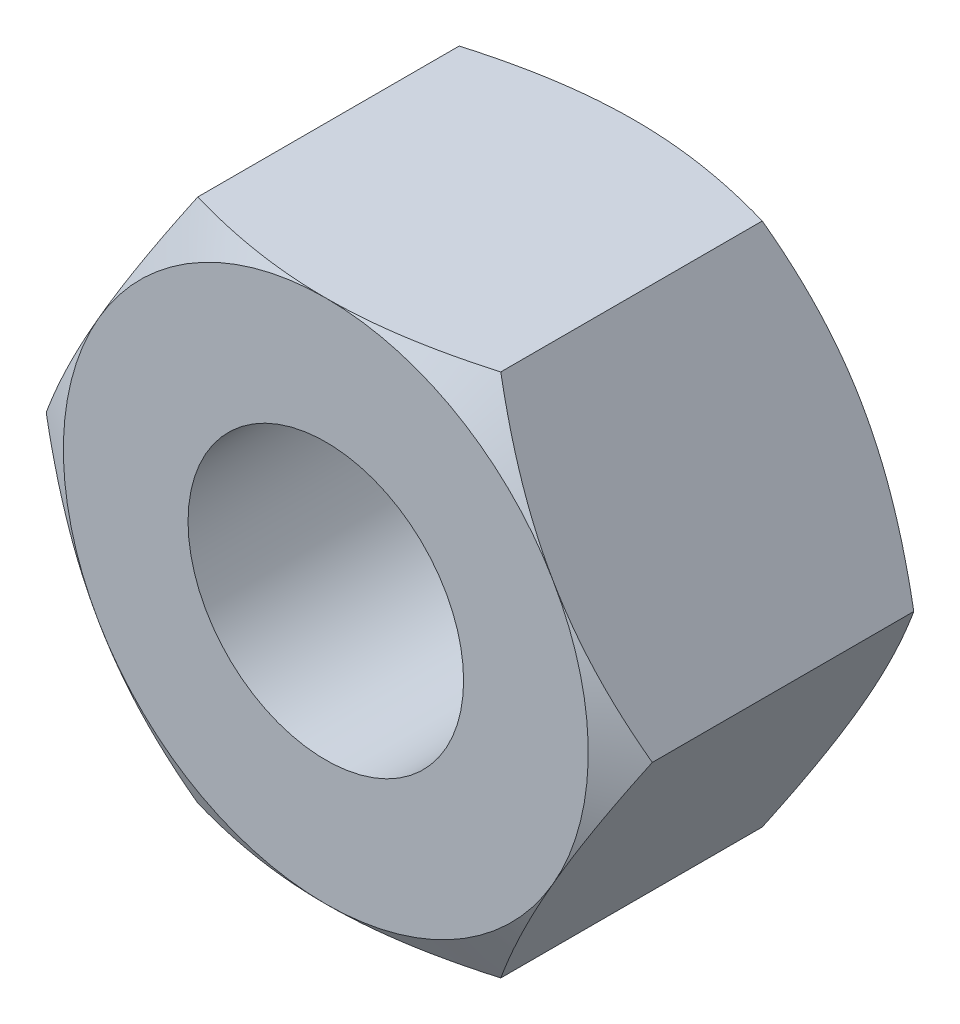
ISO-10303-21;
HEADER;
FILE_DESCRIPTION(('STEP AP214'),'2;1');
FILE_NAME('part.step','',(''),(''),'','','');
FILE_SCHEMA(('AUTOMOTIVE_DESIGN { 1 0 10303 214 1 1 1 1 }'));
ENDSEC;
DATA;
#1=APPLICATION_CONTEXT('core data for automotive mechanical design processes');
#2=APPLICATION_PROTOCOL_DEFINITION('international standard','automotive_design',2000,#1);
#3=PRODUCT_CONTEXT('',#1,'mechanical');
#4=PRODUCT('Part','Part','',(#3));
#5=PRODUCT_RELATED_PRODUCT_CATEGORY('part','',(#4));
#6=PRODUCT_DEFINITION_FORMATION('','',#4);
#7=PRODUCT_DEFINITION_CONTEXT('part definition',#1,'design');
#8=PRODUCT_DEFINITION('design','',#6,#7);
#9=PRODUCT_DEFINITION_SHAPE('','',#8);
#10=(LENGTH_UNIT() NAMED_UNIT(*) SI_UNIT(.MILLI.,.METRE.));
#11=(NAMED_UNIT(*) PLANE_ANGLE_UNIT() SI_UNIT($,.RADIAN.));
#12=(NAMED_UNIT(*) SI_UNIT($,.STERADIAN.) SOLID_ANGLE_UNIT());
#13=UNCERTAINTY_MEASURE_WITH_UNIT(LENGTH_MEASURE(1.E-05),#10,'distance_accuracy_value','');
#14=(GEOMETRIC_REPRESENTATION_CONTEXT(3) GLOBAL_UNCERTAINTY_ASSIGNED_CONTEXT((#13)) GLOBAL_UNIT_ASSIGNED_CONTEXT((#10,
#11,#12)) REPRESENTATION_CONTEXT('',''));
#15=CARTESIAN_POINT('',(0.,0.,0.));
#16=DIRECTION('',(0.,0.,1.));
#17=DIRECTION('',(1.,0.,0.));
#18=AXIS2_PLACEMENT_3D('',#15,#16,#17);
#19=CARTESIAN_POINT('',(0.,0.,4.7));
#20=DIRECTION('',(0.,0.,-1.));
#21=DIRECTION('',(-1.,0.,0.));
#22=AXIS2_PLACEMENT_3D('',#19,#20,#21);
#23=CYLINDRICAL_SURFACE('',#22,2.5);
#24=CARTESIAN_POINT('',(0.,0.,4.7));
#25=DIRECTION('',(0.,0.,-1.));
#26=DIRECTION('',(1.,0.,0.));
#27=AXIS2_PLACEMENT_3D('',#24,#25,#26);
#28=CIRCLE('',#27,2.5);
#29=CARTESIAN_POINT('',(2.5,0.,4.7));
#30=VERTEX_POINT('',#29);
#31=EDGE_CURVE('P0_E11',#30,#30,#28,.T.);
#32=ORIENTED_EDGE('',*,*,#31,.T.);
#33=CARTESIAN_POINT('',(2.5,0.,0.));
#34=DIRECTION('',(0.,0.,1.));
#35=VECTOR('',#34,1.);
#36=LINE('',#33,#35);
#37=CARTESIAN_POINT('',(2.5,0.,0.));
#38=VERTEX_POINT('',#37);
#39=EDGE_CURVE('P0_E24',#38,#30,#36,.T.);
#40=ORIENTED_EDGE('',*,*,#39,.F.);
#41=CARTESIAN_POINT('',(0.,0.,0.));
#42=DIRECTION('',(0.,0.,1.));
#43=DIRECTION('',(1.,0.,0.));
#44=AXIS2_PLACEMENT_3D('',#41,#42,#43);
#45=CIRCLE('',#44,2.5);
#46=EDGE_CURVE('P0_E33',#38,#38,#45,.T.);
#47=ORIENTED_EDGE('',*,*,#46,.T.);
#48=ORIENTED_EDGE('',*,*,#39,.T.);
#49=EDGE_LOOP('',(#32,#40,#47,#48));
#50=FACE_BOUND('',#49,.T.);
#51=ADVANCED_FACE('P0_F16',(#50),#23,.T.);
#52=OPEN_SHELL('',(#51));
#53=SHELL_BASED_SURFACE_MODEL('P0_B1',(#52));
#54=CARTESIAN_POINT('',(0.,0.,4.34059081658233));
#55=DIRECTION('',(0.,0.,-1.));
#56=DIRECTION('',(-1.,0.,0.));
#57=AXIS2_PLACEMENT_3D('',#54,#55,#56);
#58=CONICAL_SURFACE('',#57,4.62251496634281,1.04719755120482);
#59=CARTESIAN_POINT('',(3.66182548670557E-11,4.,4.69999999996809));
#60=CARTESIAN_POINT('',(1.07179676977495,4.,4.69999999996243));
#61=CARTESIAN_POINT('',(2.30940107683523,4.,4.34273441004457));
#62=(BOUNDED_CURVE() B_SPLINE_CURVE(2,(#59,#60,#61),.UNSPECIFIED.,.F.,
.F.) B_SPLINE_CURVE_WITH_KNOTS((3,3),(1.44548094706346,1.96660610414273),
.UNSPECIFIED.) CURVE() GEOMETRIC_REPRESENTATION_ITEM() RATIONAL_B_SPLINE_CURVE((2.2340862004142,
2.23408620041146,2.07368602792917)) REPRESENTATION_ITEM(''));
#63=CARTESIAN_POINT('',(2.24250503652258E-11,4.00000000000955,4.69999999995707));
#64=VERTEX_POINT('',#63);
#65=CARTESIAN_POINT('',(2.30940107675698,3.99999999999697,4.34273441006868));
#66=VERTEX_POINT('',#65);
#67=EDGE_CURVE('P1_E215',#64,#66,#62,.T.);
#68=ORIENTED_EDGE('',*,*,#67,.F.);
#69=CARTESIAN_POINT('',(0.,0.,4.69999999995707));
#70=DIRECTION('',(0.,0.,1.));
#71=DIRECTION('',(-1.,0.,0.));
#72=AXIS2_PLACEMENT_3D('',#69,#70,#71);
#73=CIRCLE('',#72,4.0000000000191);
#74=CARTESIAN_POINT('',(3.46410161512406,2.00000000004277,4.69999999995707));
#75=VERTEX_POINT('',#74);
#76=EDGE_CURVE('P1_E191',#75,#64,#73,.T.);
#77=ORIENTED_EDGE('',*,*,#76,.F.);
#78=CARTESIAN_POINT('',(2.3094010767675,3.99999999998423,4.34273441007201));
#79=CARTESIAN_POINT('',(2.92820323025991,2.92820323030239,4.69999999995706));
#80=CARTESIAN_POINT('',(3.46410161510191,2.00000000006199,4.69999999996812));
#81=(BOUNDED_CURVE() B_SPLINE_CURVE(2,(#78,#79,#80),.UNSPECIFIED.,.F.,
.F.) B_SPLINE_CURVE_WITH_KNOTS((3,3),(0.924355789986596,1.4454809470394),
.UNSPECIFIED.) CURVE() GEOMETRIC_REPRESENTATION_ITEM() RATIONAL_B_SPLINE_CURVE((2.07368602794278,
2.23408620041121,2.23408620041656)) REPRESENTATION_ITEM(''));
#82=EDGE_CURVE('P1_E28',#66,#75,#81,.T.);
#83=ORIENTED_EDGE('',*,*,#82,.F.);
#84=EDGE_LOOP('',(#68,#77,#83));
#85=FACE_BOUND('',#84,.T.);
#86=ADVANCED_FACE('P1_F17',(#85),#58,.T.);
#87=CARTESIAN_POINT('',(0.,0.,4.34059081658233));
#88=DIRECTION('',(0.,0.,-1.));
#89=DIRECTION('',(-1.,0.,0.));
#90=AXIS2_PLACEMENT_3D('',#87,#88,#89);
#91=CONICAL_SURFACE('',#90,4.62251496634281,1.04719755120482);
#92=CARTESIAN_POINT('',(-3.46410161506336,2.00000000012981,4.69999999996782));
#93=CARTESIAN_POINT('',(-2.92820323021455,2.92820323038201,4.69999999994469));
#94=CARTESIAN_POINT('',(-2.30940107670599,4.00000000009182,4.34273441003597));
#95=(BOUNDED_CURVE() B_SPLINE_CURVE(2,(#92,#93,#94),.UNSPECIFIED.,.F.,
.F.) B_SPLINE_CURVE_WITH_KNOTS((3,3),(1.44548094709226,1.96660610415005),
.UNSPECIFIED.) CURVE() GEOMETRIC_REPRESENTATION_ITEM() RATIONAL_B_SPLINE_CURVE((2.23408620041543,
2.23408620040424,2.07368602792686)) REPRESENTATION_ITEM(''));
#96=CARTESIAN_POINT('',(-3.46410161510615,2.00000000007432,4.69999999995707));
#97=VERTEX_POINT('',#96);
#98=CARTESIAN_POINT('',(-2.30940107675731,3.99999999999707,4.34273441006853));
#99=VERTEX_POINT('',#98);
#100=EDGE_CURVE('P1_E268',#97,#99,#95,.T.);
#101=ORIENTED_EDGE('',*,*,#100,.F.);
#102=CARTESIAN_POINT('',(0.,0.,4.69999999995707));
#103=DIRECTION('',(0.,0.,1.));
#104=DIRECTION('',(-1.,0.,0.));
#105=AXIS2_PLACEMENT_3D('',#102,#103,#104);
#106=CIRCLE('',#105,4.0000000000191);
#107=EDGE_CURVE('P1_E179',#64,#97,#106,.T.);
#108=ORIENTED_EDGE('',*,*,#107,.F.);
#109=CARTESIAN_POINT('',(-2.30940107674098,4.,4.34273441007178));
#110=CARTESIAN_POINT('',(-1.07179676969782,4.,4.69999999997376));
#111=CARTESIAN_POINT('',(3.66182548670557E-11,4.,4.69999999996809));
#112=(BOUNDED_CURVE() B_SPLINE_CURVE(2,(#109,#110,#111),.UNSPECIFIED.,.F.,
.F.) B_SPLINE_CURVE_WITH_KNOTS((3,3),(0.924355789984812,1.44548094706346),
.UNSPECIFIED.) CURVE() GEOMETRIC_REPRESENTATION_ITEM() RATIONAL_B_SPLINE_CURVE((2.0736860279405,
2.23408620041694,2.2340862004142)) REPRESENTATION_ITEM(''));
#113=EDGE_CURVE('P1_E197',#99,#64,#112,.T.);
#114=ORIENTED_EDGE('',*,*,#113,.F.);
#115=EDGE_LOOP('',(#101,#108,#114));
#116=FACE_BOUND('',#115,.T.);
#117=ADVANCED_FACE('P1_F485',(#116),#91,.T.);
#118=CARTESIAN_POINT('',(0.,0.,4.34059081658233));
#119=DIRECTION('',(0.,0.,-1.));
#120=DIRECTION('',(-1.,0.,0.));
#121=AXIS2_PLACEMENT_3D('',#118,#119,#120);
#122=CONICAL_SURFACE('',#121,4.62251496634281,1.04719755120482);
#123=CARTESIAN_POINT('',(-3.66182548670557E-11,-4.,4.69999999996809));
#124=CARTESIAN_POINT('',(-1.07179676977495,-4.,4.69999999996243));
#125=CARTESIAN_POINT('',(-2.30940107683523,-4.,4.34273441004457));
#126=(BOUNDED_CURVE() B_SPLINE_CURVE(2,(#123,#124,#125),.UNSPECIFIED.,.F.,
.F.) B_SPLINE_CURVE_WITH_KNOTS((3,3),(1.44548094706346,1.96660610414273),
.UNSPECIFIED.) CURVE() GEOMETRIC_REPRESENTATION_ITEM() RATIONAL_B_SPLINE_CURVE((2.2340862004142,
2.23408620041146,2.07368602792917)) REPRESENTATION_ITEM(''));
#127=CARTESIAN_POINT('',(-2.24243613466561E-11,-4.00000000000955,4.69999999995707));
#128=VERTEX_POINT('',#127);
#129=CARTESIAN_POINT('',(-2.30940107675698,-3.99999999999697,4.34273441006868));
#130=VERTEX_POINT('',#129);
#131=EDGE_CURVE('P1_E151',#128,#130,#126,.T.);
#132=ORIENTED_EDGE('',*,*,#131,.F.);
#133=CARTESIAN_POINT('',(0.,0.,4.69999999995707));
#134=DIRECTION('',(0.,0.,1.));
#135=DIRECTION('',(-1.,0.,0.));
#136=AXIS2_PLACEMENT_3D('',#133,#134,#135);
#137=CIRCLE('',#136,4.0000000000191);
#138=CARTESIAN_POINT('',(-3.46410161512406,-2.00000000004277,4.69999999995707));
#139=VERTEX_POINT('',#138);
#140=EDGE_CURVE('P1_E155',#139,#128,#137,.T.);
#141=ORIENTED_EDGE('',*,*,#140,.F.);
#142=CARTESIAN_POINT('',(-2.3094010767675,-3.99999999998423,4.34273441007201));
#143=CARTESIAN_POINT('',(-2.92820323025991,-2.92820323030239,4.69999999995706));
#144=CARTESIAN_POINT('',(-3.46410161510191,-2.00000000006199,4.69999999996812));
#145=(BOUNDED_CURVE() B_SPLINE_CURVE(2,(#142,#143,#144),.UNSPECIFIED.,.F.,
.F.) B_SPLINE_CURVE_WITH_KNOTS((3,3),(0.924355789986596,1.4454809470394),
.UNSPECIFIED.) CURVE() GEOMETRIC_REPRESENTATION_ITEM() RATIONAL_B_SPLINE_CURVE((2.07368602794278,
2.23408620041121,2.23408620041656)) REPRESENTATION_ITEM(''));
#146=EDGE_CURVE('P1_E157',#130,#139,#145,.T.);
#147=ORIENTED_EDGE('',*,*,#146,.F.);
#148=EDGE_LOOP('',(#132,#141,#147));
#149=FACE_BOUND('',#148,.T.);
#150=ADVANCED_FACE('P1_F153',(#149),#122,.T.);
#151=CARTESIAN_POINT('',(0.,0.,4.34059081658233));
#152=DIRECTION('',(0.,0.,-1.));
#153=DIRECTION('',(-1.,0.,0.));
#154=AXIS2_PLACEMENT_3D('',#151,#152,#153);
#155=CONICAL_SURFACE('',#154,4.62251496634281,1.04719755120482);
#156=CARTESIAN_POINT('',(3.46410161507275,-2.00000000011355,4.69999999996783));
#157=CARTESIAN_POINT('',(2.92820323022575,-2.92820323036259,4.6999999999476));
#158=CARTESIAN_POINT('',(2.30940107672136,-4.0000000000652,4.34273441004484));
#159=(BOUNDED_CURVE() B_SPLINE_CURVE(2,(#156,#157,#158),.UNSPECIFIED.,.F.,
.F.) B_SPLINE_CURVE_WITH_KNOTS((3,3),(1.4454809470881,1.96660610414455),
.UNSPECIFIED.) CURVE() GEOMETRIC_REPRESENTATION_ITEM() RATIONAL_B_SPLINE_CURVE((2.23408620041586,
2.23408620040607,2.07368602793095)) REPRESENTATION_ITEM(''));
#160=CARTESIAN_POINT('',(3.46410161510615,-2.00000000007432,4.69999999995707));
#161=VERTEX_POINT('',#160);
#162=CARTESIAN_POINT('',(2.30940107676069,-3.99999999999707,4.34273441006756));
#163=VERTEX_POINT('',#162);
#164=EDGE_CURVE('P1_E140',#161,#163,#159,.T.);
#165=ORIENTED_EDGE('',*,*,#164,.F.);
#166=CARTESIAN_POINT('',(0.,0.,4.69999999995707));
#167=DIRECTION('',(0.,0.,1.));
#168=DIRECTION('',(-1.,0.,0.));
#169=AXIS2_PLACEMENT_3D('',#166,#167,#168);
#170=CIRCLE('',#169,4.0000000000191);
#171=EDGE_CURVE('P1_E174',#128,#161,#170,.T.);
#172=ORIENTED_EDGE('',*,*,#171,.F.);
#173=CARTESIAN_POINT('',(2.30940107674437,-4.,4.3427344100708));
#174=CARTESIAN_POINT('',(1.07179676969919,-4.,4.69999999997376));
#175=CARTESIAN_POINT('',(-3.66182548670557E-11,-4.,4.69999999996809));
#176=(BOUNDED_CURVE() B_SPLINE_CURVE(2,(#173,#174,#175),.UNSPECIFIED.,.F.,
.F.) B_SPLINE_CURVE_WITH_KNOTS((3,3),(0.924355789984149,1.44548094706346),
.UNSPECIFIED.) CURVE() GEOMETRIC_REPRESENTATION_ITEM() RATIONAL_B_SPLINE_CURVE((2.0736860279401,
2.23408620041694,2.2340862004142)) REPRESENTATION_ITEM(''));
#177=EDGE_CURVE('P1_E161',#163,#128,#176,.T.);
#178=ORIENTED_EDGE('',*,*,#177,.F.);
#179=EDGE_LOOP('',(#165,#172,#178));
#180=FACE_BOUND('',#179,.T.);
#181=ADVANCED_FACE('P1_F181',(#180),#155,.T.);
#182=CARTESIAN_POINT('',(0.,0.,4.34059081658233));
#183=DIRECTION('',(0.,0.,-1.));
#184=DIRECTION('',(1.,-7.40373284194033E-12,0.));
#185=AXIS2_PLACEMENT_3D('',#182,#183,#184);
#186=CONICAL_SURFACE('',#185,4.62251496634281,1.04719755120482);
#187=CARTESIAN_POINT('',(3.46410161510191,2.00000000006199,4.69999999996812));
#188=CARTESIAN_POINT('',(3.99999999999599,1.07179676973137,4.69999999997918));
#189=CARTESIAN_POINT('',(4.61880215355484,-6.55402737590437E-11,4.34273441004488));
#190=(BOUNDED_CURVE() B_SPLINE_CURVE(2,(#187,#188,#189),.UNSPECIFIED.,.F.,
.F.) B_SPLINE_CURVE_WITH_KNOTS((3,3),(1.4454809470394,1.96660610414535),
.UNSPECIFIED.) CURVE() GEOMETRIC_REPRESENTATION_ITEM() RATIONAL_B_SPLINE_CURVE((2.23408620041656,
2.23408620042192,2.07368602793148)) REPRESENTATION_ITEM(''));
#191=CARTESIAN_POINT('',(4.61880215351561,2.6767396888784E-12,4.34273441006753));
#192=VERTEX_POINT('',#191);
#193=EDGE_CURVE('P1_E11',#75,#192,#190,.T.);
#194=ORIENTED_EDGE('',*,*,#193,.F.);
#195=CARTESIAN_POINT('',(0.,0.,4.69999999995707));
#196=DIRECTION('',(0.,0.,1.));
#197=DIRECTION('',(-1.,0.,0.));
#198=AXIS2_PLACEMENT_3D('',#195,#196,#197);
#199=CIRCLE('',#198,4.0000000000191);
#200=EDGE_CURVE('P1_E183',#161,#75,#199,.T.);
#201=ORIENTED_EDGE('',*,*,#200,.F.);
#202=CARTESIAN_POINT('',(4.6188021535101,-1.30056032353959E-11,4.34273441007071));
#203=CARTESIAN_POINT('',(3.99999999996242,-1.07179676979057,4.69999999998805));
#204=CARTESIAN_POINT('',(3.46410161507275,-2.00000000011355,4.69999999996783));
#205=(BOUNDED_CURVE() B_SPLINE_CURVE(2,(#202,#203,#204),.UNSPECIFIED.,.F.,
.F.) B_SPLINE_CURVE_WITH_KNOTS((3,3),(0.92435578998558,1.4454809470881),
.UNSPECIFIED.) CURVE() GEOMETRIC_REPRESENTATION_ITEM() RATIONAL_B_SPLINE_CURVE((2.07368602794173,
2.23408620042564,2.23408620041586)) REPRESENTATION_ITEM(''));
#206=EDGE_CURVE('P1_E341',#192,#161,#205,.T.);
#207=ORIENTED_EDGE('',*,*,#206,.F.);
#208=EDGE_LOOP('',(#194,#201,#207));
#209=FACE_BOUND('',#208,.T.);
#210=ADVANCED_FACE('P1_F479',(#209),#186,.T.);
#211=CARTESIAN_POINT('',(4.618802153517,0.,0.));
#212=DIRECTION('',(0.866025403784429,0.500000000000017,0.));
#213=DIRECTION('',(0.,0.,-1.));
#214=AXIS2_PLACEMENT_3D('',#211,#212,#213);
#215=PLANE('',#214);
#216=ORIENTED_EDGE('',*,*,#82,.T.);
#217=ORIENTED_EDGE('',*,*,#193,.T.);
#218=DIRECTION('',(0.,0.,1.));
#219=VECTOR('',#218,1.);
#220=CARTESIAN_POINT('',(4.61880215351745,-2.61943244872498E-13,0.));
#221=LINE('',#220,#219);
#222=CARTESIAN_POINT('',(4.61880215317892,2.54155789650753E-09,0.357265588955263));
#223=VERTEX_POINT('',#222);
#224=EDGE_CURVE('P1_E346',#223,#192,#221,.T.);
#225=ORIENTED_EDGE('',*,*,#224,.F.);
#226=CARTESIAN_POINT('',(3.46410161506614,2.00000000012394,-1.10560827263049E-11));
#227=CARTESIAN_POINT('',(3.9999999988729,1.07179677167663,-3.31883288756533E-11));
#228=CARTESIAN_POINT('',(4.61880215080823,4.69172971282422E-09,0.357265588350319));
#229=(BOUNDED_CURVE() B_SPLINE_CURVE(2,(#226,#227,#228),.UNSPECIFIED.,.F.,
.F.) B_SPLINE_CURVE_WITH_KNOTS((3,3),(1.44548094695617,1.96660610299033),
.UNSPECIFIED.) CURVE() GEOMETRIC_REPRESENTATION_ITEM() RATIONAL_B_SPLINE_CURVE((2.23408620033144,
2.23408620034214,2.0736860285133)) REPRESENTATION_ITEM(''));
#230=CARTESIAN_POINT('',(3.46410161510216,2.00000000008071,-5.52814214486881E-12));
#231=VERTEX_POINT('',#230);
#232=EDGE_CURVE('P1_E373',#231,#223,#229,.T.);
#233=ORIENTED_EDGE('',*,*,#232,.F.);
#234=CARTESIAN_POINT('',(2.30940107441569,4.00000000405769,0.357265591266766));
#235=CARTESIAN_POINT('',(2.92820322929549,2.92820323197281,1.10758624494167E-11));
#236=CARTESIAN_POINT('',(3.46410161506614,2.00000000012394,-1.10560827263049E-11));
#237=(BOUNDED_CURVE() B_SPLINE_CURVE(2,(#234,#235,#236),.UNSPECIFIED.,.F.,
.F.) B_SPLINE_CURVE_WITH_KNOTS((3,3),(0.924355789017257,1.44548094695617),
.UNSPECIFIED.) CURVE() GEOMETRIC_REPRESENTATION_ITEM() RATIONAL_B_SPLINE_CURVE((2.07368602729792,
2.23408620032073,2.23408620033144)) REPRESENTATION_ITEM(''));
#238=CARTESIAN_POINT('',(2.30940107369644,4.00000000135256,0.357265588863049));
#239=VERTEX_POINT('',#238);
#240=EDGE_CURVE('P1_E194',#239,#231,#237,.T.);
#241=ORIENTED_EDGE('',*,*,#240,.F.);
#242=DIRECTION('',(0.,0.,-1.));
#243=VECTOR('',#242,1.);
#244=CARTESIAN_POINT('',(2.309401076759,4.,0.));
#245=LINE('',#244,#243);
#246=EDGE_CURVE('P1_E223',#66,#239,#245,.T.);
#247=ORIENTED_EDGE('',*,*,#246,.F.);
#248=EDGE_LOOP('',(#216,#217,#225,#233,#241,#247));
#249=FACE_BOUND('',#248,.T.);
#250=ADVANCED_FACE('P1_F525',(#249),#215,.T.);
#251=CARTESIAN_POINT('',(2.309401076759,4.,0.));
#252=DIRECTION('',(0.,1.,0.));
#253=DIRECTION('',(1.,0.,0.));
#254=AXIS2_PLACEMENT_3D('',#251,#252,#253);
#255=PLANE('',#254);
#256=ORIENTED_EDGE('',*,*,#113,.T.);
#257=ORIENTED_EDGE('',*,*,#67,.T.);
#258=ORIENTED_EDGE('',*,*,#246,.T.);
#259=CARTESIAN_POINT('',(7.32261732337704E-11,4.,-1.10268622282816E-11));
#260=CARTESIAN_POINT('',(1.07179676701302,4.,3.01202219303915E-13));
#261=CARTESIAN_POINT('',(2.30940106991464,4.,0.357265587938579));
#262=(BOUNDED_CURVE() B_SPLINE_CURVE(2,(#259,#260,#261),.UNSPECIFIED.,.F.,
.F.) B_SPLINE_CURVE_WITH_KNOTS((3,3),(1.44548094700775,1.9666061027103),
.UNSPECIFIED.) CURVE() GEOMETRIC_REPRESENTATION_ITEM() RATIONAL_B_SPLINE_CURVE((2.23408620033035,
2.23408620032487,2.07368602868389)) REPRESENTATION_ITEM(''));
#263=CARTESIAN_POINT('',(4.48505649186444E-11,4.00000000000955,-5.51350336750885E-12));
#264=VERTEX_POINT('',#263);
#265=EDGE_CURVE('P1_E184',#264,#239,#262,.T.);
#266=ORIENTED_EDGE('',*,*,#265,.F.);
#267=CARTESIAN_POINT('',(-2.30940108144335,4.,0.357265591266632));
#268=CARTESIAN_POINT('',(-1.0717967715682,4.,-2.23550067346423E-11));
#269=CARTESIAN_POINT('',(7.32261732337704E-11,4.,-1.10268622282816E-11));
#270=(BOUNDED_CURVE() B_SPLINE_CURVE(2,(#267,#268,#269),.UNSPECIFIED.,.F.,
.F.) B_SPLINE_CURVE_WITH_KNOTS((3,3),(0.924355789016622,1.44548094700775),
.UNSPECIFIED.) CURVE() GEOMETRIC_REPRESENTATION_ITEM() RATIONAL_B_SPLINE_CURVE((2.07368602729699,
2.23408620033583,2.23408620033035)) REPRESENTATION_ITEM(''));
#271=CARTESIAN_POINT('',(-2.30940107946081,3.99999999802483,0.357265588863464));
#272=VERTEX_POINT('',#271);
#273=EDGE_CURVE('P1_E298',#272,#264,#270,.T.);
#274=ORIENTED_EDGE('',*,*,#273,.F.);
#275=DIRECTION('',(0.,0.,-1.));
#276=VECTOR('',#275,1.);
#277=CARTESIAN_POINT('',(-2.309401076759,4.,0.));
#278=LINE('',#277,#276);
#279=EDGE_CURVE('P1_E274',#99,#272,#278,.T.);
#280=ORIENTED_EDGE('',*,*,#279,.F.);
#281=EDGE_LOOP('',(#256,#257,#258,#266,#274,#280));
#282=FACE_BOUND('',#281,.T.);
#283=ADVANCED_FACE('P1_F482',(#282),#255,.T.);
#284=CARTESIAN_POINT('',(-2.309401076759,4.,0.));
#285=DIRECTION('',(-0.866025403784429,0.500000000000017,0.));
#286=DIRECTION('',(0.,0.,1.));
#287=AXIS2_PLACEMENT_3D('',#284,#285,#286);
#288=PLANE('',#287);
#289=CARTESIAN_POINT('',(-4.61880215350842,1.59138214461101E-11,4.34273441007168));
#290=CARTESIAN_POINT('',(-3.99999999996174,1.07179676979174,4.69999999998806));
#291=CARTESIAN_POINT('',(-3.46410161507275,2.00000000011355,4.69999999996783));
#292=(BOUNDED_CURVE() B_SPLINE_CURVE(2,(#289,#290,#291),.UNSPECIFIED.,.F.,
.F.) B_SPLINE_CURVE_WITH_KNOTS((3,3),(0.924355789985938,1.4454809470877),
.UNSPECIFIED.) CURVE() GEOMETRIC_REPRESENTATION_ITEM() RATIONAL_B_SPLINE_CURVE((2.07368602794174,
2.23408620042522,2.23408620041543)) REPRESENTATION_ITEM(''));
#293=CARTESIAN_POINT('',(-4.61880215351388,1.97673993109799E-13,4.34273441006852));
#294=VERTEX_POINT('',#293);
#295=EDGE_CURVE('P1_E249',#294,#97,#292,.T.);
#296=ORIENTED_EDGE('',*,*,#295,.T.);
#297=ORIENTED_EDGE('',*,*,#100,.T.);
#298=ORIENTED_EDGE('',*,*,#279,.T.);
#299=CARTESIAN_POINT('',(-3.46410161500736,2.0000000002268,-1.07533424496539E-11));
#300=CARTESIAN_POINT('',(-2.92820323158086,2.92820322801548,2.97057451398053E-11));
#301=CARTESIAN_POINT('',(-2.30940108018009,3.99999999407449,0.357265587939208));
#302=(BOUNDED_CURVE() B_SPLINE_CURVE(2,(#299,#300,#301),.UNSPECIFIED.,.F.,
.F.) B_SPLINE_CURVE_WITH_KNOTS((3,3),(1.44548094705656,1.96660610271435),
.UNSPECIFIED.) CURVE() GEOMETRIC_REPRESENTATION_ITEM() RATIONAL_B_SPLINE_CURVE((2.23408620033337,
2.2340862003138,2.07368602868656)) REPRESENTATION_ITEM(''));
#303=CARTESIAN_POINT('',(-3.4641016150661,2.00000000014368,-5.37676726910402E-12));
#304=VERTEX_POINT('',#303);
#305=EDGE_CURVE('P1_E112',#304,#272,#302,.T.);
#306=ORIENTED_EDGE('',*,*,#305,.F.);
#307=CARTESIAN_POINT('',(-4.61880215586014,-4.05739378498988E-09,0.357265591267044));
#308=CARTESIAN_POINT('',(-4.00000000087192,1.07179676821527,-5.12123399243336E-11));
#309=CARTESIAN_POINT('',(-3.46410161500736,2.0000000002268,-1.07533424496539E-11));
#310=(BOUNDED_CURVE() B_SPLINE_CURVE(2,(#307,#308,#309),.UNSPECIFIED.,.F.,
.F.) B_SPLINE_CURVE_WITH_KNOTS((3,3),(0.92435578901878,1.44548094705656),
.UNSPECIFIED.) CURVE() GEOMETRIC_REPRESENTATION_ITEM() RATIONAL_B_SPLINE_CURVE((2.07368602729974,
2.23408620035294,2.23408620033337)) REPRESENTATION_ITEM(''));
#311=CARTESIAN_POINT('',(-4.61880215315746,-3.32802725439609E-09,0.357265588863191));
#312=VERTEX_POINT('',#311);
#313=EDGE_CURVE('P1_E328',#312,#304,#310,.T.);
#314=ORIENTED_EDGE('',*,*,#313,.F.);
#315=DIRECTION('',(0.,0.,-1.));
#316=VECTOR('',#315,1.);
#317=CARTESIAN_POINT('',(-4.618802153517,0.,0.));
#318=LINE('',#317,#316);
#319=EDGE_CURVE('P1_E275',#294,#312,#318,.T.);
#320=ORIENTED_EDGE('',*,*,#319,.F.);
#321=EDGE_LOOP('',(#296,#297,#298,#306,#314,#320));
#322=FACE_BOUND('',#321,.T.);
#323=ADVANCED_FACE('P1_F486',(#322),#288,.T.);
#324=CARTESIAN_POINT('',(-4.618802153517,0.,0.));
#325=DIRECTION('',(-0.866025403784429,-0.500000000000017,0.));
#326=DIRECTION('',(-0.500000000000017,0.866025403784429,0.));
#327=AXIS2_PLACEMENT_3D('',#324,#325,#326);
#328=PLANE('',#327);
#329=ORIENTED_EDGE('',*,*,#146,.T.);
#330=CARTESIAN_POINT('',(-3.4641016151019,-2.00000000006199,4.69999999996813));
#331=CARTESIAN_POINT('',(-3.99999999997723,-1.07179676976388,4.69999999997919));
#332=CARTESIAN_POINT('',(-4.61880215350816,-1.53195426880385E-11,4.34273441007183));
#333=(BOUNDED_CURVE() B_SPLINE_CURVE(2,(#330,#331,#332),.UNSPECIFIED.,.F.,
.F.) B_SPLINE_CURVE_WITH_KNOTS((3,3),(-1.44548094707197,-0.924355789984839),
.UNSPECIFIED.) CURVE() GEOMETRIC_REPRESENTATION_ITEM() RATIONAL_B_SPLINE_CURVE((2.23408620041423,
2.23408620041958,2.07368602794054)) REPRESENTATION_ITEM(''));
#334=EDGE_CURVE('P1_E242',#139,#294,#333,.T.);
#335=ORIENTED_EDGE('',*,*,#334,.T.);
#336=ORIENTED_EDGE('',*,*,#319,.T.);
#337=CARTESIAN_POINT('',(-3.46410161506615,-2.00000000012393,-1.10566790630206E-11));
#338=CARTESIAN_POINT('',(-3.99999999858633,-1.07179677217299,-3.31871892291066E-11));
#339=CARTESIAN_POINT('',(-4.61880215009523,-5.92668829943014E-09,0.357265587938667));
#340=(BOUNDED_CURVE() B_SPLINE_CURVE(2,(#337,#338,#339),.UNSPECIFIED.,.F.,
.F.) B_SPLINE_CURVE_WITH_KNOTS((3,3),(1.4454809469564,1.96660610271194),
.UNSPECIFIED.) CURVE() GEOMETRIC_REPRESENTATION_ITEM() RATIONAL_B_SPLINE_CURVE((2.23408620033168,
2.23408620034238,2.07368602868507)) REPRESENTATION_ITEM(''));
#341=CARTESIAN_POINT('',(-3.46410161510216,-2.00000000008071,-5.52796137506446E-12));
#342=VERTEX_POINT('',#341);
#343=EDGE_CURVE('P1_E283',#342,#312,#340,.T.);
#344=ORIENTED_EDGE('',*,*,#343,.F.);
#345=CARTESIAN_POINT('',(-2.30940107441569,-4.00000000405768,0.357265591266761));
#346=CARTESIAN_POINT('',(-2.9282032292955,-2.9282032319728,1.10737252700943E-11));
#347=CARTESIAN_POINT('',(-3.46410161506615,-2.00000000012393,-1.10566790630206E-11));
#348=(BOUNDED_CURVE() B_SPLINE_CURVE(2,(#345,#346,#347),.UNSPECIFIED.,.F.,
.F.) B_SPLINE_CURVE_WITH_KNOTS((3,3),(0.924355789017426,1.4454809469564),
.UNSPECIFIED.) CURVE() GEOMETRIC_REPRESENTATION_ITEM() RATIONAL_B_SPLINE_CURVE((2.07368602729815,
2.23408620032097,2.23408620033168)) REPRESENTATION_ITEM(''));
#349=CARTESIAN_POINT('',(-2.30940107369645,-4.00000000135256,0.357265588863054));
#350=VERTEX_POINT('',#349);
#351=EDGE_CURVE('P1_E213',#350,#342,#348,.T.);
#352=ORIENTED_EDGE('',*,*,#351,.F.);
#353=DIRECTION('',(0.,0.,-1.));
#354=VECTOR('',#353,1.);
#355=CARTESIAN_POINT('',(-2.309401076759,-4.,0.));
#356=LINE('',#355,#354);
#357=EDGE_CURVE('P1_E160',#130,#350,#356,.T.);
#358=ORIENTED_EDGE('',*,*,#357,.F.);
#359=EDGE_LOOP('',(#329,#335,#336,#344,#352,#358));
#360=FACE_BOUND('',#359,.T.);
#361=ADVANCED_FACE('P1_F452',(#360),#328,.T.);
#362=CARTESIAN_POINT('',(2.309401076759,-4.,0.));
#363=DIRECTION('',(0.866025403784429,-0.500000000000017,0.));
#364=DIRECTION('',(0.,0.,-1.));
#365=AXIS2_PLACEMENT_3D('',#362,#363,#364);
#366=PLANE('',#365);
#367=ORIENTED_EDGE('',*,*,#206,.T.);
#368=ORIENTED_EDGE('',*,*,#164,.T.);
#369=DIRECTION('',(0.,0.,1.));
#370=VECTOR('',#369,1.);
#371=CARTESIAN_POINT('',(2.309401076759,-4.,0.));
#372=LINE('',#371,#370);
#373=CARTESIAN_POINT('',(2.30940107946145,-3.99999999802436,0.357265588863214));
#374=VERTEX_POINT('',#373);
#375=EDGE_CURVE('P1_E166',#374,#163,#372,.T.);
#376=ORIENTED_EDGE('',*,*,#375,.F.);
#377=CARTESIAN_POINT('',(3.46410161507275,-2.00000000011355,-1.07532430639055E-11));
#378=CARTESIAN_POINT('',(2.92820323161623,-2.92820322795422,9.47541431512444E-12));
#379=CARTESIAN_POINT('',(2.30940108018091,-3.99999999407308,0.357265587938736));
#380=(BOUNDED_CURVE() B_SPLINE_CURVE(2,(#377,#378,#379),.UNSPECIFIED.,.F.,
.F.) B_SPLINE_CURVE_WITH_KNOTS((3,3),(1.44548094702435,1.96660610271351),
.UNSPECIFIED.) CURVE() GEOMETRIC_REPRESENTATION_ITEM() RATIONAL_B_SPLINE_CURVE((2.23408620033293,
2.23408620032314,2.07368602868635)) REPRESENTATION_ITEM(''));
#381=CARTESIAN_POINT('',(3.46410161510615,-2.00000000007432,0.));
#382=VERTEX_POINT('',#381);
#383=EDGE_CURVE('P1_E204',#382,#374,#380,.T.);
#384=ORIENTED_EDGE('',*,*,#383,.F.);
#385=CARTESIAN_POINT('',(4.61880215521109,2.93320618763638E-09,0.357265590892315));
#386=CARTESIAN_POINT('',(4.00000000064609,-1.07179676860642,-3.09819392363408E-11));
#387=CARTESIAN_POINT('',(3.46410161507275,-2.00000000011355,-1.07532430639055E-11));
#388=(BOUNDED_CURVE() B_SPLINE_CURVE(2,(#385,#386,#387),.UNSPECIFIED.,.F.,
.F.) B_SPLINE_CURVE_WITH_KNOTS((3,3),(0.924355789272152,1.44548094702435),
.UNSPECIFIED.) CURVE() GEOMETRIC_REPRESENTATION_ITEM() RATIONAL_B_SPLINE_CURVE((2.0736860274555,
2.23408620034271,2.23408620033293)) REPRESENTATION_ITEM(''));
#389=EDGE_CURVE('P1_E379',#223,#382,#388,.T.);
#390=ORIENTED_EDGE('',*,*,#389,.F.);
#391=ORIENTED_EDGE('',*,*,#224,.T.);
#392=EDGE_LOOP('',(#367,#368,#376,#384,#390,#391));
#393=FACE_BOUND('',#392,.T.);
#394=ADVANCED_FACE('P1_F464',(#393),#366,.T.);
#395=CARTESIAN_POINT('',(-2.309401076759,-4.,0.));
#396=DIRECTION('',(0.,-1.,0.));
#397=DIRECTION('',(0.,0.,-1.));
#398=AXIS2_PLACEMENT_3D('',#395,#396,#397);
#399=PLANE('',#398);
#400=ORIENTED_EDGE('',*,*,#177,.T.);
#401=ORIENTED_EDGE('',*,*,#131,.T.);
#402=ORIENTED_EDGE('',*,*,#357,.T.);
#403=CARTESIAN_POINT('',(-7.32261732337704E-11,-4.,-1.10268622282816E-11));
#404=CARTESIAN_POINT('',(-1.07179676701303,-4.,3.01202219304064E-13));
#405=CARTESIAN_POINT('',(-2.30940106991467,-4.,0.35726558793859));
#406=(BOUNDED_CURVE() B_SPLINE_CURVE(2,(#403,#404,#405),.UNSPECIFIED.,.F.,
.F.) B_SPLINE_CURVE_WITH_KNOTS((3,3),(1.44548094700775,1.96660610271031),
.UNSPECIFIED.) CURVE() GEOMETRIC_REPRESENTATION_ITEM() RATIONAL_B_SPLINE_CURVE((2.23408620033035,
2.23408620032487,2.07368602868389)) REPRESENTATION_ITEM(''));
#407=CARTESIAN_POINT('',(-4.48502661788694E-11,-4.00000000000955,-5.51349457753027E-12));
#408=VERTEX_POINT('',#407);
#409=EDGE_CURVE('P1_E126',#408,#350,#406,.T.);
#410=ORIENTED_EDGE('',*,*,#409,.F.);
#411=CARTESIAN_POINT('',(2.30940108144445,-4.,0.357265591266951));
#412=CARTESIAN_POINT('',(1.07179677156864,-4.,-2.23549789790667E-11));
#413=CARTESIAN_POINT('',(-7.32261732337704E-11,-4.,-1.10268622282816E-11));
#414=(BOUNDED_CURVE() B_SPLINE_CURVE(2,(#411,#412,#413),.UNSPECIFIED.,.F.,
.F.) B_SPLINE_CURVE_WITH_KNOTS((3,3),(0.924355789016406,1.44548094700775),
.UNSPECIFIED.) CURVE() GEOMETRIC_REPRESENTATION_ITEM() RATIONAL_B_SPLINE_CURVE((2.07368602729685,
2.23408620033583,2.23408620033035)) REPRESENTATION_ITEM(''));
#415=EDGE_CURVE('P1_E214',#374,#408,#414,.T.);
#416=ORIENTED_EDGE('',*,*,#415,.F.);
#417=ORIENTED_EDGE('',*,*,#375,.T.);
#418=EDGE_LOOP('',(#400,#401,#402,#410,#416,#417));
#419=FACE_BOUND('',#418,.T.);
#420=ADVANCED_FACE('P1_F164',(#419),#399,.T.);
#421=CARTESIAN_POINT('',(0.,0.,4.7));
#422=DIRECTION('',(0.,0.,1.));
#423=DIRECTION('',(1.,0.,0.));
#424=AXIS2_PLACEMENT_3D('',#421,#422,#423);
#425=PLANE('',#424);
#426=CARTESIAN_POINT('',(0.,0.,4.7));
#427=DIRECTION('',(0.,0.,-1.));
#428=DIRECTION('',(1.,0.,0.));
#429=AXIS2_PLACEMENT_3D('',#426,#427,#428);
#430=CIRCLE('',#429,2.1);
#431=CARTESIAN_POINT('',(-2.1,0.,4.7));
#432=VERTEX_POINT('',#431);
#433=EDGE_CURVE('P1_E289',#432,#432,#430,.T.);
#434=ORIENTED_EDGE('',*,*,#433,.T.);
#435=EDGE_LOOP('',(#434));
#436=FACE_BOUND('',#435,.T.);
#437=ORIENTED_EDGE('',*,*,#171,.T.);
#438=ORIENTED_EDGE('',*,*,#200,.T.);
#439=ORIENTED_EDGE('',*,*,#76,.T.);
#440=ORIENTED_EDGE('',*,*,#107,.T.);
#441=CARTESIAN_POINT('',(0.,0.,4.69999999995707));
#442=DIRECTION('',(0.,0.,1.));
#443=DIRECTION('',(-1.,0.,0.));
#444=AXIS2_PLACEMENT_3D('',#441,#442,#443);
#445=CIRCLE('',#444,4.0000000000191);
#446=EDGE_CURVE('P1_E177',#97,#139,#445,.T.);
#447=ORIENTED_EDGE('',*,*,#446,.T.);
#448=ORIENTED_EDGE('',*,*,#140,.T.);
#449=EDGE_LOOP('',(#437,#438,#439,#440,#447,#448));
#450=FACE_BOUND('',#449,.T.);
#451=ADVANCED_FACE('P1_F172',(#436,#450),#425,.T.);
#452=CARTESIAN_POINT('',(0.,0.,0.35940918343158));
#453=DIRECTION('',(0.,0.,1.));
#454=DIRECTION('',(1.,0.,0.));
#455=AXIS2_PLACEMENT_3D('',#452,#453,#454);
#456=CONICAL_SURFACE('',#455,4.62251496639965,1.04719755117588);
#457=ORIENTED_EDGE('',*,*,#240,.T.);
#458=CARTESIAN_POINT('',(0.,0.,0.));
#459=DIRECTION('',(0.,0.,1.));
#460=DIRECTION('',(1.,0.,0.));
#461=AXIS2_PLACEMENT_3D('',#458,#459,#460);
#462=CIRCLE('',#461,4.0000000000191);
#463=EDGE_CURVE('P1_E262',#231,#264,#462,.T.);
#464=ORIENTED_EDGE('',*,*,#463,.T.);
#465=ORIENTED_EDGE('',*,*,#265,.T.);
#466=EDGE_LOOP('',(#457,#464,#465));
#467=FACE_BOUND('',#466,.T.);
#468=ADVANCED_FACE('P1_F19',(#467),#456,.T.);
#469=CARTESIAN_POINT('',(0.,0.,0.35940918343158));
#470=DIRECTION('',(0.,0.,1.));
#471=DIRECTION('',(1.,0.,0.));
#472=AXIS2_PLACEMENT_3D('',#469,#470,#471);
#473=CONICAL_SURFACE('',#472,4.62251496639965,1.04719755117588);
#474=ORIENTED_EDGE('',*,*,#273,.T.);
#475=CARTESIAN_POINT('',(0.,0.,0.));
#476=DIRECTION('',(0.,0.,1.));
#477=DIRECTION('',(1.,0.,0.));
#478=AXIS2_PLACEMENT_3D('',#475,#476,#477);
#479=CIRCLE('',#478,4.0000000000191);
#480=EDGE_CURVE('P1_E257',#264,#304,#479,.T.);
#481=ORIENTED_EDGE('',*,*,#480,.T.);
#482=ORIENTED_EDGE('',*,*,#305,.T.);
#483=EDGE_LOOP('',(#474,#481,#482));
#484=FACE_BOUND('',#483,.T.);
#485=ADVANCED_FACE('P1_F425',(#484),#473,.T.);
#486=CARTESIAN_POINT('',(0.,0.,0.35940918343158));
#487=DIRECTION('',(0.,0.,1.));
#488=DIRECTION('',(-1.,1.48093645054E-11,0.));
#489=AXIS2_PLACEMENT_3D('',#486,#487,#488);
#490=CONICAL_SURFACE('',#489,4.62251496639965,1.04719755117588);
#491=ORIENTED_EDGE('',*,*,#343,.T.);
#492=ORIENTED_EDGE('',*,*,#313,.T.);
#493=CARTESIAN_POINT('',(0.,0.,0.));
#494=DIRECTION('',(0.,0.,1.));
#495=DIRECTION('',(1.,0.,0.));
#496=AXIS2_PLACEMENT_3D('',#493,#494,#495);
#497=CIRCLE('',#496,4.0000000000191);
#498=EDGE_CURVE('P1_E250',#304,#342,#497,.T.);
#499=ORIENTED_EDGE('',*,*,#498,.T.);
#500=EDGE_LOOP('',(#491,#492,#499));
#501=FACE_BOUND('',#500,.T.);
#502=ADVANCED_FACE('P1_F513',(#501),#490,.T.);
#503=CARTESIAN_POINT('',(0.,0.,0.35940918343158));
#504=DIRECTION('',(0.,0.,1.));
#505=DIRECTION('',(1.,0.,0.));
#506=AXIS2_PLACEMENT_3D('',#503,#504,#505);
#507=CONICAL_SURFACE('',#506,4.62251496639965,1.04719755117588);
#508=ORIENTED_EDGE('',*,*,#351,.T.);
#509=CARTESIAN_POINT('',(0.,0.,0.));
#510=DIRECTION('',(0.,0.,1.));
#511=DIRECTION('',(1.,0.,0.));
#512=AXIS2_PLACEMENT_3D('',#509,#510,#511);
#513=CIRCLE('',#512,4.0000000000191);
#514=EDGE_CURVE('P1_E248',#342,#408,#513,.T.);
#515=ORIENTED_EDGE('',*,*,#514,.T.);
#516=ORIENTED_EDGE('',*,*,#409,.T.);
#517=EDGE_LOOP('',(#508,#515,#516));
#518=FACE_BOUND('',#517,.T.);
#519=ADVANCED_FACE('P1_F456',(#518),#507,.T.);
#520=CARTESIAN_POINT('',(0.,0.,0.35940918343158));
#521=DIRECTION('',(0.,0.,1.));
#522=DIRECTION('',(1.,0.,0.));
#523=AXIS2_PLACEMENT_3D('',#520,#521,#522);
#524=CONICAL_SURFACE('',#523,4.62251496639965,1.04719755117588);
#525=ORIENTED_EDGE('',*,*,#415,.T.);
#526=CARTESIAN_POINT('',(0.,0.,0.));
#527=DIRECTION('',(0.,0.,1.));
#528=DIRECTION('',(1.,0.,0.));
#529=AXIS2_PLACEMENT_3D('',#526,#527,#528);
#530=CIRCLE('',#529,4.0000000000191);
#531=EDGE_CURVE('P1_E258',#408,#382,#530,.T.);
#532=ORIENTED_EDGE('',*,*,#531,.T.);
#533=ORIENTED_EDGE('',*,*,#383,.T.);
#534=EDGE_LOOP('',(#525,#532,#533));
#535=FACE_BOUND('',#534,.T.);
#536=ADVANCED_FACE('P1_F459',(#535),#524,.T.);
#537=CARTESIAN_POINT('',(0.,0.,0.));
#538=DIRECTION('',(0.,0.,1.));
#539=DIRECTION('',(1.,0.,0.));
#540=AXIS2_PLACEMENT_3D('',#537,#538,#539);
#541=PLANE('',#540);
#542=CARTESIAN_POINT('',(0.,0.,0.));
#543=DIRECTION('',(0.,0.,-1.));
#544=DIRECTION('',(1.,0.,0.));
#545=AXIS2_PLACEMENT_3D('',#542,#543,#544);
#546=CIRCLE('',#545,2.1);
#547=CARTESIAN_POINT('',(-2.1,0.,0.));
#548=VERTEX_POINT('',#547);
#549=EDGE_CURVE('P1_E21',#548,#548,#546,.T.);
#550=ORIENTED_EDGE('',*,*,#549,.F.);
#551=EDGE_LOOP('',(#550));
#552=FACE_BOUND('',#551,.T.);
#553=ORIENTED_EDGE('',*,*,#514,.F.);
#554=ORIENTED_EDGE('',*,*,#498,.F.);
#555=ORIENTED_EDGE('',*,*,#480,.F.);
#556=ORIENTED_EDGE('',*,*,#463,.F.);
#557=CARTESIAN_POINT('',(0.,0.,0.));
#558=DIRECTION('',(0.,0.,1.));
#559=DIRECTION('',(1.,0.,0.));
#560=AXIS2_PLACEMENT_3D('',#557,#558,#559);
#561=CIRCLE('',#560,4.0000000000191);
#562=EDGE_CURVE('P1_E292',#382,#231,#561,.T.);
#563=ORIENTED_EDGE('',*,*,#562,.F.);
#564=ORIENTED_EDGE('',*,*,#531,.F.);
#565=EDGE_LOOP('',(#553,#554,#555,#556,#563,#564));
#566=FACE_BOUND('',#565,.T.);
#567=ADVANCED_FACE('P1_F422',(#552,#566),#541,.F.);
#568=CARTESIAN_POINT('',(0.,0.,4.34059081658233));
#569=DIRECTION('',(0.,0.,-1.));
#570=DIRECTION('',(-1.,0.,0.));
#571=AXIS2_PLACEMENT_3D('',#568,#569,#570);
#572=CONICAL_SURFACE('',#571,4.62251496634281,1.04719755120482);
#573=ORIENTED_EDGE('',*,*,#446,.F.);
#574=ORIENTED_EDGE('',*,*,#295,.F.);
#575=ORIENTED_EDGE('',*,*,#334,.F.);
#576=EDGE_LOOP('',(#573,#574,#575));
#577=FACE_BOUND('',#576,.T.);
#578=ADVANCED_FACE('P1_F488',(#577),#572,.T.);
#579=CARTESIAN_POINT('',(0.,0.,0.35940918343158));
#580=DIRECTION('',(0.,0.,1.));
#581=DIRECTION('',(1.,0.,0.));
#582=AXIS2_PLACEMENT_3D('',#579,#580,#581);
#583=CONICAL_SURFACE('',#582,4.62251496639965,1.04719755117588);
#584=ORIENTED_EDGE('',*,*,#562,.T.);
#585=ORIENTED_EDGE('',*,*,#232,.T.);
#586=ORIENTED_EDGE('',*,*,#389,.T.);
#587=EDGE_LOOP('',(#584,#585,#586));
#588=FACE_BOUND('',#587,.T.);
#589=ADVANCED_FACE('P1_F462',(#588),#583,.T.);
#590=CARTESIAN_POINT('',(0.,0.,4.7));
#591=DIRECTION('',(0.,0.,1.));
#592=DIRECTION('',(1.,0.,0.));
#593=AXIS2_PLACEMENT_3D('',#590,#591,#592);
#594=CYLINDRICAL_SURFACE('',#593,2.1);
#595=ORIENTED_EDGE('',*,*,#549,.T.);
#596=DIRECTION('',(0.,0.,1.));
#597=VECTOR('',#596,1.);
#598=CARTESIAN_POINT('',(-2.1,0.,4.7));
#599=LINE('',#598,#597);
#600=EDGE_CURVE('P1_E293',#548,#432,#599,.T.);
#601=ORIENTED_EDGE('',*,*,#600,.T.);
#602=ORIENTED_EDGE('',*,*,#433,.F.);
#603=ORIENTED_EDGE('',*,*,#600,.F.);
#604=EDGE_LOOP('',(#595,#601,#602,#603));
#605=FACE_BOUND('',#604,.T.);
#606=ADVANCED_FACE('P1_F496',(#605),#594,.F.);
#607=CLOSED_SHELL('',(#86,#117,#150,#181,#210,#250,#283,#323,#361,#394,#420,#451,#468,#485,#502,
#519,#536,#567,#578,#589,#606));
#608=MANIFOLD_SOLID_BREP('P1_B1',#607);
#609=ADVANCED_BREP_SHAPE_REPRESENTATION('',(#18,#608),#14);
#610=MANIFOLD_SURFACE_SHAPE_REPRESENTATION('',(#18,#53),#14);
#611=SHAPE_REPRESENTATION('',(#18),#14);
#612=SHAPE_DEFINITION_REPRESENTATION(#9,#611);
#613=SHAPE_REPRESENTATION_RELATIONSHIP('','',#611,#609);
#614=SHAPE_REPRESENTATION_RELATIONSHIP('','',#611,#610);
ENDSEC;
END-ISO-10303-21;
